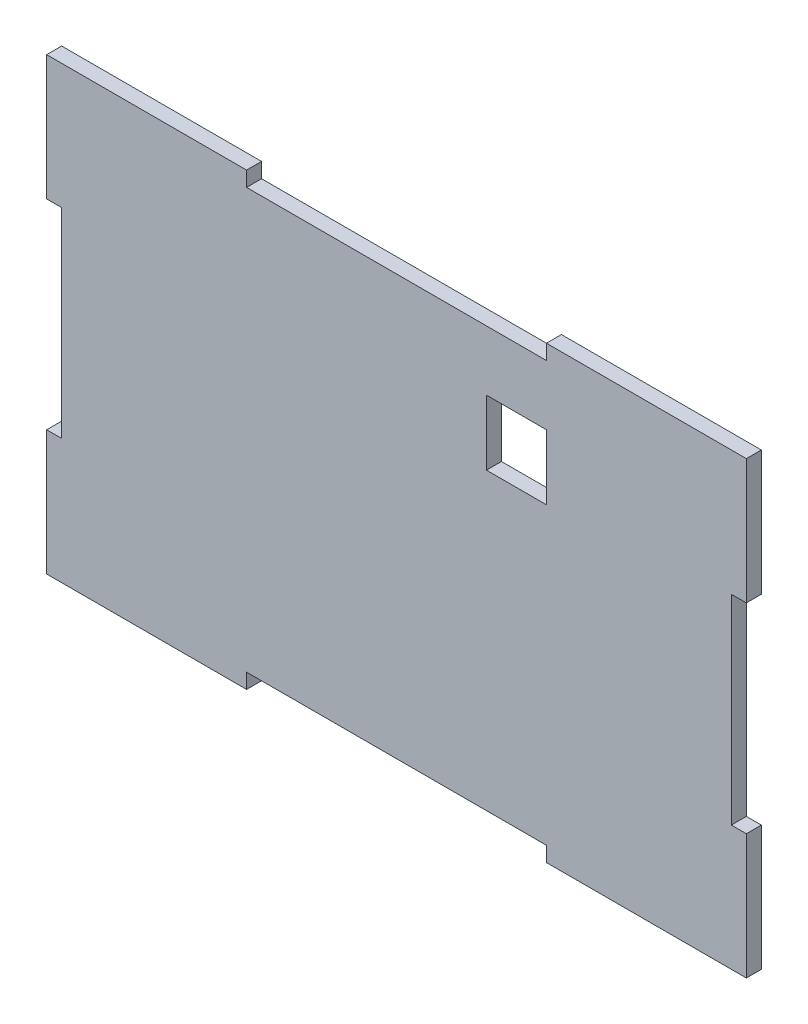
ISO-10303-21;
HEADER;
FILE_DESCRIPTION(('STEP AP214'),'2;1');
FILE_NAME('part.step','',(''),(''),'','','');
FILE_SCHEMA(('AUTOMOTIVE_DESIGN { 1 0 10303 214 1 1 1 1 }'));
ENDSEC;
DATA;
#1=APPLICATION_CONTEXT('core data for automotive mechanical design processes');
#2=APPLICATION_PROTOCOL_DEFINITION('international standard','automotive_design',2000,#1);
#3=PRODUCT_CONTEXT('',#1,'mechanical');
#4=PRODUCT('Part','Part','',(#3));
#5=PRODUCT_RELATED_PRODUCT_CATEGORY('part','',(#4));
#6=PRODUCT_DEFINITION_FORMATION('','',#4);
#7=PRODUCT_DEFINITION_CONTEXT('part definition',#1,'design');
#8=PRODUCT_DEFINITION('design','',#6,#7);
#9=PRODUCT_DEFINITION_SHAPE('','',#8);
#10=(LENGTH_UNIT() NAMED_UNIT(*) SI_UNIT(.MILLI.,.METRE.));
#11=(NAMED_UNIT(*) PLANE_ANGLE_UNIT() SI_UNIT($,.RADIAN.));
#12=(NAMED_UNIT(*) SI_UNIT($,.STERADIAN.) SOLID_ANGLE_UNIT());
#13=UNCERTAINTY_MEASURE_WITH_UNIT(LENGTH_MEASURE(1.E-05),#10,'distance_accuracy_value','');
#14=(GEOMETRIC_REPRESENTATION_CONTEXT(3) GLOBAL_UNCERTAINTY_ASSIGNED_CONTEXT((#13)) GLOBAL_UNIT_ASSIGNED_CONTEXT((#10,
#11,#12)) REPRESENTATION_CONTEXT('',''));
#15=CARTESIAN_POINT('',(0.,0.,0.));
#16=DIRECTION('',(0.,0.,1.));
#17=DIRECTION('',(1.,0.,0.));
#18=AXIS2_PLACEMENT_3D('',#15,#16,#17);
#19=CARTESIAN_POINT('',(0.,0.,3.));
#20=DIRECTION('',(1.,0.,0.));
#21=DIRECTION('',(0.,0.,-1.));
#22=AXIS2_PLACEMENT_3D('',#19,#20,#21);
#23=PLANE('',#22);
#24=DIRECTION('',(0.,-1.,0.));
#25=VECTOR('',#24,1.);
#26=CARTESIAN_POINT('',(0.,0.,0.));
#27=LINE('',#26,#25);
#28=CARTESIAN_POINT('',(0.,25.,0.));
#29=VERTEX_POINT('',#28);
#30=CARTESIAN_POINT('',(0.,0.,0.));
#31=VERTEX_POINT('',#30);
#32=EDGE_CURVE('E228',#29,#31,#27,.T.);
#33=ORIENTED_EDGE('',*,*,#32,.T.);
#34=DIRECTION('',(0.,0.,-1.));
#35=VECTOR('',#34,1.);
#36=CARTESIAN_POINT('',(0.,0.,3.));
#37=LINE('',#36,#35);
#38=CARTESIAN_POINT('',(0.,0.,3.));
#39=VERTEX_POINT('',#38);
#40=EDGE_CURVE('E11',#39,#31,#37,.T.);
#41=ORIENTED_EDGE('',*,*,#40,.F.);
#42=DIRECTION('',(0.,-1.,0.));
#43=VECTOR('',#42,1.);
#44=CARTESIAN_POINT('',(0.,0.,3.));
#45=LINE('',#44,#43);
#46=CARTESIAN_POINT('',(0.,25.,3.));
#47=VERTEX_POINT('',#46);
#48=EDGE_CURVE('E232',#47,#39,#45,.T.);
#49=ORIENTED_EDGE('',*,*,#48,.F.);
#50=DIRECTION('',(0.,0.,-1.));
#51=VECTOR('',#50,1.);
#52=CARTESIAN_POINT('',(0.,25.,3.));
#53=LINE('',#52,#51);
#54=EDGE_CURVE('E274',#47,#29,#53,.T.);
#55=ORIENTED_EDGE('',*,*,#54,.T.);
#56=EDGE_LOOP('',(#33,#41,#49,#55));
#57=FACE_BOUND('',#56,.T.);
#58=ADVANCED_FACE('F35',(#57),#23,.F.);
#59=CARTESIAN_POINT('',(0.,0.,3.));
#60=DIRECTION('',(0.,1.,0.));
#61=DIRECTION('',(0.,0.,1.));
#62=AXIS2_PLACEMENT_3D('',#59,#60,#61);
#63=PLANE('',#62);
#64=DIRECTION('',(1.,0.,0.));
#65=VECTOR('',#64,1.);
#66=CARTESIAN_POINT('',(0.,0.,0.));
#67=LINE('',#66,#65);
#68=CARTESIAN_POINT('',(40.,0.,0.));
#69=VERTEX_POINT('',#68);
#70=EDGE_CURVE('E277',#31,#69,#67,.T.);
#71=ORIENTED_EDGE('',*,*,#70,.T.);
#72=DIRECTION('',(0.,0.,-1.));
#73=VECTOR('',#72,1.);
#74=CARTESIAN_POINT('',(40.,0.,3.));
#75=LINE('',#74,#73);
#76=CARTESIAN_POINT('',(40.,0.,3.));
#77=VERTEX_POINT('',#76);
#78=EDGE_CURVE('E42',#77,#69,#75,.T.);
#79=ORIENTED_EDGE('',*,*,#78,.F.);
#80=DIRECTION('',(1.,0.,0.));
#81=VECTOR('',#80,1.);
#82=CARTESIAN_POINT('',(0.,0.,3.));
#83=LINE('',#82,#81);
#84=EDGE_CURVE('E235',#39,#77,#83,.T.);
#85=ORIENTED_EDGE('',*,*,#84,.F.);
#86=ORIENTED_EDGE('',*,*,#40,.T.);
#87=EDGE_LOOP('',(#71,#79,#85,#86));
#88=FACE_BOUND('',#87,.T.);
#89=ADVANCED_FACE('F392',(#88),#63,.F.);
#90=CARTESIAN_POINT('',(40.,0.,3.));
#91=DIRECTION('',(-1.,0.,0.));
#92=DIRECTION('',(0.,0.,1.));
#93=AXIS2_PLACEMENT_3D('',#90,#91,#92);
#94=PLANE('',#93);
#95=DIRECTION('',(0.,1.,0.));
#96=VECTOR('',#95,1.);
#97=CARTESIAN_POINT('',(40.,0.,0.));
#98=LINE('',#97,#96);
#99=CARTESIAN_POINT('',(40.,3.,0.));
#100=VERTEX_POINT('',#99);
#101=EDGE_CURVE('E279',#69,#100,#98,.T.);
#102=ORIENTED_EDGE('',*,*,#101,.T.);
#103=DIRECTION('',(0.,0.,-1.));
#104=VECTOR('',#103,1.);
#105=CARTESIAN_POINT('',(40.,3.,3.));
#106=LINE('',#105,#104);
#107=CARTESIAN_POINT('',(40.,3.,3.));
#108=VERTEX_POINT('',#107);
#109=EDGE_CURVE('E364',#108,#100,#106,.T.);
#110=ORIENTED_EDGE('',*,*,#109,.F.);
#111=DIRECTION('',(0.,1.,0.));
#112=VECTOR('',#111,1.);
#113=CARTESIAN_POINT('',(40.,0.,3.));
#114=LINE('',#113,#112);
#115=EDGE_CURVE('E238',#77,#108,#114,.T.);
#116=ORIENTED_EDGE('',*,*,#115,.F.);
#117=ORIENTED_EDGE('',*,*,#78,.T.);
#118=EDGE_LOOP('',(#102,#110,#116,#117));
#119=FACE_BOUND('',#118,.T.);
#120=ADVANCED_FACE('F371',(#119),#94,.F.);
#121=CARTESIAN_POINT('',(40.,3.,3.));
#122=DIRECTION('',(0.,1.,0.));
#123=DIRECTION('',(-1.,0.,0.));
#124=AXIS2_PLACEMENT_3D('',#121,#122,#123);
#125=PLANE('',#124);
#126=DIRECTION('',(1.,0.,0.));
#127=VECTOR('',#126,1.);
#128=CARTESIAN_POINT('',(40.,3.,0.));
#129=LINE('',#128,#127);
#130=CARTESIAN_POINT('',(100.,3.,0.));
#131=VERTEX_POINT('',#130);
#132=EDGE_CURVE('E281',#100,#131,#129,.T.);
#133=ORIENTED_EDGE('',*,*,#132,.T.);
#134=DIRECTION('',(0.,0.,-1.));
#135=VECTOR('',#134,1.);
#136=CARTESIAN_POINT('',(100.,3.,3.));
#137=LINE('',#136,#135);
#138=CARTESIAN_POINT('',(100.,3.,3.));
#139=VERTEX_POINT('',#138);
#140=EDGE_CURVE('E361',#139,#131,#137,.T.);
#141=ORIENTED_EDGE('',*,*,#140,.F.);
#142=DIRECTION('',(1.,0.,0.));
#143=VECTOR('',#142,1.);
#144=CARTESIAN_POINT('',(40.,3.,3.));
#145=LINE('',#144,#143);
#146=EDGE_CURVE('E240',#108,#139,#145,.T.);
#147=ORIENTED_EDGE('',*,*,#146,.F.);
#148=ORIENTED_EDGE('',*,*,#109,.T.);
#149=EDGE_LOOP('',(#133,#141,#147,#148));
#150=FACE_BOUND('',#149,.T.);
#151=ADVANCED_FACE('F380',(#150),#125,.F.);
#152=CARTESIAN_POINT('',(100.,0.,3.));
#153=DIRECTION('',(1.,0.,0.));
#154=DIRECTION('',(0.,0.,-1.));
#155=AXIS2_PLACEMENT_3D('',#152,#153,#154);
#156=PLANE('',#155);
#157=DIRECTION('',(0.,-1.,0.));
#158=VECTOR('',#157,1.);
#159=CARTESIAN_POINT('',(100.,0.,0.));
#160=LINE('',#159,#158);
#161=CARTESIAN_POINT('',(100.,0.,0.));
#162=VERTEX_POINT('',#161);
#163=EDGE_CURVE('E283',#131,#162,#160,.T.);
#164=ORIENTED_EDGE('',*,*,#163,.T.);
#165=DIRECTION('',(0.,0.,-1.));
#166=VECTOR('',#165,1.);
#167=CARTESIAN_POINT('',(100.,0.,3.));
#168=LINE('',#167,#166);
#169=CARTESIAN_POINT('',(100.,0.,3.));
#170=VERTEX_POINT('',#169);
#171=EDGE_CURVE('E358',#170,#162,#168,.T.);
#172=ORIENTED_EDGE('',*,*,#171,.F.);
#173=DIRECTION('',(0.,-1.,0.));
#174=VECTOR('',#173,1.);
#175=CARTESIAN_POINT('',(100.,0.,3.));
#176=LINE('',#175,#174);
#177=EDGE_CURVE('E242',#139,#170,#176,.T.);
#178=ORIENTED_EDGE('',*,*,#177,.F.);
#179=ORIENTED_EDGE('',*,*,#140,.T.);
#180=EDGE_LOOP('',(#164,#172,#178,#179));
#181=FACE_BOUND('',#180,.T.);
#182=ADVANCED_FACE('F384',(#181),#156,.F.);
#183=CARTESIAN_POINT('',(140.,0.,3.));
#184=DIRECTION('',(0.,1.,0.));
#185=DIRECTION('',(0.,0.,1.));
#186=AXIS2_PLACEMENT_3D('',#183,#184,#185);
#187=PLANE('',#186);
#188=DIRECTION('',(1.,0.,0.));
#189=VECTOR('',#188,1.);
#190=CARTESIAN_POINT('',(140.,0.,0.));
#191=LINE('',#190,#189);
#192=CARTESIAN_POINT('',(140.,0.,0.));
#193=VERTEX_POINT('',#192);
#194=EDGE_CURVE('E285',#162,#193,#191,.T.);
#195=ORIENTED_EDGE('',*,*,#194,.T.);
#196=DIRECTION('',(0.,0.,-1.));
#197=VECTOR('',#196,1.);
#198=CARTESIAN_POINT('',(140.,0.,3.));
#199=LINE('',#198,#197);
#200=CARTESIAN_POINT('',(140.,0.,3.));
#201=VERTEX_POINT('',#200);
#202=EDGE_CURVE('E355',#201,#193,#199,.T.);
#203=ORIENTED_EDGE('',*,*,#202,.F.);
#204=DIRECTION('',(1.,0.,0.));
#205=VECTOR('',#204,1.);
#206=CARTESIAN_POINT('',(140.,0.,3.));
#207=LINE('',#206,#205);
#208=EDGE_CURVE('E244',#170,#201,#207,.T.);
#209=ORIENTED_EDGE('',*,*,#208,.F.);
#210=ORIENTED_EDGE('',*,*,#171,.T.);
#211=EDGE_LOOP('',(#195,#203,#209,#210));
#212=FACE_BOUND('',#211,.T.);
#213=ADVANCED_FACE('F465',(#212),#187,.F.);
#214=CARTESIAN_POINT('',(140.,0.,3.));
#215=DIRECTION('',(-1.,0.,0.));
#216=DIRECTION('',(0.,0.,1.));
#217=AXIS2_PLACEMENT_3D('',#214,#215,#216);
#218=PLANE('',#217);
#219=DIRECTION('',(0.,1.,0.));
#220=VECTOR('',#219,1.);
#221=CARTESIAN_POINT('',(140.,0.,0.));
#222=LINE('',#221,#220);
#223=CARTESIAN_POINT('',(140.,25.,0.));
#224=VERTEX_POINT('',#223);
#225=EDGE_CURVE('E287',#193,#224,#222,.T.);
#226=ORIENTED_EDGE('',*,*,#225,.T.);
#227=DIRECTION('',(0.,0.,-1.));
#228=VECTOR('',#227,1.);
#229=CARTESIAN_POINT('',(140.,25.,3.));
#230=LINE('',#229,#228);
#231=CARTESIAN_POINT('',(140.,25.,3.));
#232=VERTEX_POINT('',#231);
#233=EDGE_CURVE('E352',#232,#224,#230,.T.);
#234=ORIENTED_EDGE('',*,*,#233,.F.);
#235=DIRECTION('',(0.,1.,0.));
#236=VECTOR('',#235,1.);
#237=CARTESIAN_POINT('',(140.,0.,3.));
#238=LINE('',#237,#236);
#239=EDGE_CURVE('E246',#201,#232,#238,.T.);
#240=ORIENTED_EDGE('',*,*,#239,.F.);
#241=ORIENTED_EDGE('',*,*,#202,.T.);
#242=EDGE_LOOP('',(#226,#234,#240,#241));
#243=FACE_BOUND('',#242,.T.);
#244=ADVANCED_FACE('F463',(#243),#218,.F.);
#245=CARTESIAN_POINT('',(140.,25.,3.));
#246=DIRECTION('',(0.,-1.,0.));
#247=DIRECTION('',(0.,0.,-1.));
#248=AXIS2_PLACEMENT_3D('',#245,#246,#247);
#249=PLANE('',#248);
#250=DIRECTION('',(-1.,0.,0.));
#251=VECTOR('',#250,1.);
#252=CARTESIAN_POINT('',(140.,25.,0.));
#253=LINE('',#252,#251);
#254=CARTESIAN_POINT('',(137.,25.,0.));
#255=VERTEX_POINT('',#254);
#256=EDGE_CURVE('E289',#224,#255,#253,.T.);
#257=ORIENTED_EDGE('',*,*,#256,.T.);
#258=DIRECTION('',(0.,0.,-1.));
#259=VECTOR('',#258,1.);
#260=CARTESIAN_POINT('',(137.,25.,3.));
#261=LINE('',#260,#259);
#262=CARTESIAN_POINT('',(137.,25.,3.));
#263=VERTEX_POINT('',#262);
#264=EDGE_CURVE('E349',#263,#255,#261,.T.);
#265=ORIENTED_EDGE('',*,*,#264,.F.);
#266=DIRECTION('',(-1.,0.,0.));
#267=VECTOR('',#266,1.);
#268=CARTESIAN_POINT('',(140.,25.,3.));
#269=LINE('',#268,#267);
#270=EDGE_CURVE('E248',#232,#263,#269,.T.);
#271=ORIENTED_EDGE('',*,*,#270,.F.);
#272=ORIENTED_EDGE('',*,*,#233,.T.);
#273=EDGE_LOOP('',(#257,#265,#271,#272));
#274=FACE_BOUND('',#273,.T.);
#275=ADVANCED_FACE('F458',(#274),#249,.F.);
#276=CARTESIAN_POINT('',(137.,25.,3.));
#277=DIRECTION('',(-1.,0.,0.));
#278=DIRECTION('',(0.,0.,1.));
#279=AXIS2_PLACEMENT_3D('',#276,#277,#278);
#280=PLANE('',#279);
#281=DIRECTION('',(0.,1.,0.));
#282=VECTOR('',#281,1.);
#283=CARTESIAN_POINT('',(137.,25.,0.));
#284=LINE('',#283,#282);
#285=CARTESIAN_POINT('',(137.,65.,0.));
#286=VERTEX_POINT('',#285);
#287=EDGE_CURVE('E291',#255,#286,#284,.T.);
#288=ORIENTED_EDGE('',*,*,#287,.T.);
#289=DIRECTION('',(0.,0.,-1.));
#290=VECTOR('',#289,1.);
#291=CARTESIAN_POINT('',(137.,65.,3.));
#292=LINE('',#291,#290);
#293=CARTESIAN_POINT('',(137.,65.,3.));
#294=VERTEX_POINT('',#293);
#295=EDGE_CURVE('E346',#294,#286,#292,.T.);
#296=ORIENTED_EDGE('',*,*,#295,.F.);
#297=DIRECTION('',(0.,1.,0.));
#298=VECTOR('',#297,1.);
#299=CARTESIAN_POINT('',(137.,25.,3.));
#300=LINE('',#299,#298);
#301=EDGE_CURVE('E250',#263,#294,#300,.T.);
#302=ORIENTED_EDGE('',*,*,#301,.F.);
#303=ORIENTED_EDGE('',*,*,#264,.T.);
#304=EDGE_LOOP('',(#288,#296,#302,#303));
#305=FACE_BOUND('',#304,.T.);
#306=ADVANCED_FACE('F453',(#305),#280,.F.);
#307=CARTESIAN_POINT('',(140.,65.,3.));
#308=DIRECTION('',(0.,1.,0.));
#309=DIRECTION('',(0.,0.,1.));
#310=AXIS2_PLACEMENT_3D('',#307,#308,#309);
#311=PLANE('',#310);
#312=DIRECTION('',(1.,0.,0.));
#313=VECTOR('',#312,1.);
#314=CARTESIAN_POINT('',(140.,65.,0.));
#315=LINE('',#314,#313);
#316=CARTESIAN_POINT('',(140.,65.,0.));
#317=VERTEX_POINT('',#316);
#318=EDGE_CURVE('E293',#286,#317,#315,.T.);
#319=ORIENTED_EDGE('',*,*,#318,.T.);
#320=DIRECTION('',(0.,0.,-1.));
#321=VECTOR('',#320,1.);
#322=CARTESIAN_POINT('',(140.,65.,3.));
#323=LINE('',#322,#321);
#324=CARTESIAN_POINT('',(140.,65.,3.));
#325=VERTEX_POINT('',#324);
#326=EDGE_CURVE('E343',#325,#317,#323,.T.);
#327=ORIENTED_EDGE('',*,*,#326,.F.);
#328=DIRECTION('',(1.,0.,0.));
#329=VECTOR('',#328,1.);
#330=CARTESIAN_POINT('',(140.,65.,3.));
#331=LINE('',#330,#329);
#332=EDGE_CURVE('E252',#294,#325,#331,.T.);
#333=ORIENTED_EDGE('',*,*,#332,.F.);
#334=ORIENTED_EDGE('',*,*,#295,.T.);
#335=EDGE_LOOP('',(#319,#327,#333,#334));
#336=FACE_BOUND('',#335,.T.);
#337=ADVANCED_FACE('F449',(#336),#311,.F.);
#338=CARTESIAN_POINT('',(140.,90.,3.));
#339=DIRECTION('',(-1.,0.,0.));
#340=DIRECTION('',(0.,0.,1.));
#341=AXIS2_PLACEMENT_3D('',#338,#339,#340);
#342=PLANE('',#341);
#343=DIRECTION('',(0.,1.,0.));
#344=VECTOR('',#343,1.);
#345=CARTESIAN_POINT('',(140.,90.,0.));
#346=LINE('',#345,#344);
#347=CARTESIAN_POINT('',(140.,90.,0.));
#348=VERTEX_POINT('',#347);
#349=EDGE_CURVE('E295',#317,#348,#346,.T.);
#350=ORIENTED_EDGE('',*,*,#349,.T.);
#351=DIRECTION('',(0.,0.,-1.));
#352=VECTOR('',#351,1.);
#353=CARTESIAN_POINT('',(140.,90.,3.));
#354=LINE('',#353,#352);
#355=CARTESIAN_POINT('',(140.,90.,3.));
#356=VERTEX_POINT('',#355);
#357=EDGE_CURVE('E340',#356,#348,#354,.T.);
#358=ORIENTED_EDGE('',*,*,#357,.F.);
#359=DIRECTION('',(0.,1.,0.));
#360=VECTOR('',#359,1.);
#361=CARTESIAN_POINT('',(140.,90.,3.));
#362=LINE('',#361,#360);
#363=EDGE_CURVE('E254',#325,#356,#362,.T.);
#364=ORIENTED_EDGE('',*,*,#363,.F.);
#365=ORIENTED_EDGE('',*,*,#326,.T.);
#366=EDGE_LOOP('',(#350,#358,#364,#365));
#367=FACE_BOUND('',#366,.T.);
#368=ADVANCED_FACE('F444',(#367),#342,.F.);
#369=CARTESIAN_POINT('',(140.,90.,3.));
#370=DIRECTION('',(0.,-1.,0.));
#371=DIRECTION('',(0.,0.,-1.));
#372=AXIS2_PLACEMENT_3D('',#369,#370,#371);
#373=PLANE('',#372);
#374=DIRECTION('',(-1.,0.,0.));
#375=VECTOR('',#374,1.);
#376=CARTESIAN_POINT('',(140.,90.,0.));
#377=LINE('',#376,#375);
#378=CARTESIAN_POINT('',(100.,90.,0.));
#379=VERTEX_POINT('',#378);
#380=EDGE_CURVE('E297',#348,#379,#377,.T.);
#381=ORIENTED_EDGE('',*,*,#380,.T.);
#382=DIRECTION('',(0.,0.,-1.));
#383=VECTOR('',#382,1.);
#384=CARTESIAN_POINT('',(100.,90.,3.));
#385=LINE('',#384,#383);
#386=CARTESIAN_POINT('',(100.,90.,3.));
#387=VERTEX_POINT('',#386);
#388=EDGE_CURVE('E337',#387,#379,#385,.T.);
#389=ORIENTED_EDGE('',*,*,#388,.F.);
#390=DIRECTION('',(-1.,0.,0.));
#391=VECTOR('',#390,1.);
#392=CARTESIAN_POINT('',(140.,90.,3.));
#393=LINE('',#392,#391);
#394=EDGE_CURVE('E256',#356,#387,#393,.T.);
#395=ORIENTED_EDGE('',*,*,#394,.F.);
#396=ORIENTED_EDGE('',*,*,#357,.T.);
#397=EDGE_LOOP('',(#381,#389,#395,#396));
#398=FACE_BOUND('',#397,.T.);
#399=ADVANCED_FACE('F438',(#398),#373,.F.);
#400=CARTESIAN_POINT('',(100.,90.,3.));
#401=DIRECTION('',(1.,0.,0.));
#402=DIRECTION('',(0.,0.,-1.));
#403=AXIS2_PLACEMENT_3D('',#400,#401,#402);
#404=PLANE('',#403);
#405=DIRECTION('',(0.,-1.,0.));
#406=VECTOR('',#405,1.);
#407=CARTESIAN_POINT('',(100.,90.,0.));
#408=LINE('',#407,#406);
#409=CARTESIAN_POINT('',(100.,87.,0.));
#410=VERTEX_POINT('',#409);
#411=EDGE_CURVE('E299',#379,#410,#408,.T.);
#412=ORIENTED_EDGE('',*,*,#411,.T.);
#413=DIRECTION('',(0.,0.,-1.));
#414=VECTOR('',#413,1.);
#415=CARTESIAN_POINT('',(100.,87.,3.));
#416=LINE('',#415,#414);
#417=CARTESIAN_POINT('',(100.,87.,3.));
#418=VERTEX_POINT('',#417);
#419=EDGE_CURVE('E334',#418,#410,#416,.T.);
#420=ORIENTED_EDGE('',*,*,#419,.F.);
#421=DIRECTION('',(0.,-1.,0.));
#422=VECTOR('',#421,1.);
#423=CARTESIAN_POINT('',(100.,90.,3.));
#424=LINE('',#423,#422);
#425=EDGE_CURVE('E258',#387,#418,#424,.T.);
#426=ORIENTED_EDGE('',*,*,#425,.F.);
#427=ORIENTED_EDGE('',*,*,#388,.T.);
#428=EDGE_LOOP('',(#412,#420,#426,#427));
#429=FACE_BOUND('',#428,.T.);
#430=ADVANCED_FACE('F434',(#429),#404,.F.);
#431=CARTESIAN_POINT('',(40.,87.,3.));
#432=DIRECTION('',(0.,-1.,0.));
#433=DIRECTION('',(0.,0.,-1.));
#434=AXIS2_PLACEMENT_3D('',#431,#432,#433);
#435=PLANE('',#434);
#436=DIRECTION('',(-1.,0.,0.));
#437=VECTOR('',#436,1.);
#438=CARTESIAN_POINT('',(40.,87.,0.));
#439=LINE('',#438,#437);
#440=CARTESIAN_POINT('',(40.,87.,0.));
#441=VERTEX_POINT('',#440);
#442=EDGE_CURVE('E301',#410,#441,#439,.T.);
#443=ORIENTED_EDGE('',*,*,#442,.T.);
#444=DIRECTION('',(0.,0.,-1.));
#445=VECTOR('',#444,1.);
#446=CARTESIAN_POINT('',(40.,87.,3.));
#447=LINE('',#446,#445);
#448=CARTESIAN_POINT('',(40.,87.,3.));
#449=VERTEX_POINT('',#448);
#450=EDGE_CURVE('E331',#449,#441,#447,.T.);
#451=ORIENTED_EDGE('',*,*,#450,.F.);
#452=DIRECTION('',(-1.,0.,0.));
#453=VECTOR('',#452,1.);
#454=CARTESIAN_POINT('',(40.,87.,3.));
#455=LINE('',#454,#453);
#456=EDGE_CURVE('E260',#418,#449,#455,.T.);
#457=ORIENTED_EDGE('',*,*,#456,.F.);
#458=ORIENTED_EDGE('',*,*,#419,.T.);
#459=EDGE_LOOP('',(#443,#451,#457,#458));
#460=FACE_BOUND('',#459,.T.);
#461=ADVANCED_FACE('F429',(#460),#435,.F.);
#462=CARTESIAN_POINT('',(40.,90.,3.));
#463=DIRECTION('',(-1.,0.,0.));
#464=DIRECTION('',(0.,0.,1.));
#465=AXIS2_PLACEMENT_3D('',#462,#463,#464);
#466=PLANE('',#465);
#467=DIRECTION('',(0.,1.,0.));
#468=VECTOR('',#467,1.);
#469=CARTESIAN_POINT('',(40.,90.,0.));
#470=LINE('',#469,#468);
#471=CARTESIAN_POINT('',(40.,90.,0.));
#472=VERTEX_POINT('',#471);
#473=EDGE_CURVE('E303',#441,#472,#470,.T.);
#474=ORIENTED_EDGE('',*,*,#473,.T.);
#475=DIRECTION('',(0.,0.,-1.));
#476=VECTOR('',#475,1.);
#477=CARTESIAN_POINT('',(40.,90.,3.));
#478=LINE('',#477,#476);
#479=CARTESIAN_POINT('',(40.,90.,3.));
#480=VERTEX_POINT('',#479);
#481=EDGE_CURVE('E328',#480,#472,#478,.T.);
#482=ORIENTED_EDGE('',*,*,#481,.F.);
#483=DIRECTION('',(0.,1.,0.));
#484=VECTOR('',#483,1.);
#485=CARTESIAN_POINT('',(40.,90.,3.));
#486=LINE('',#485,#484);
#487=EDGE_CURVE('E262',#449,#480,#486,.T.);
#488=ORIENTED_EDGE('',*,*,#487,.F.);
#489=ORIENTED_EDGE('',*,*,#450,.T.);
#490=EDGE_LOOP('',(#474,#482,#488,#489));
#491=FACE_BOUND('',#490,.T.);
#492=ADVANCED_FACE('F423',(#491),#466,.F.);
#493=CARTESIAN_POINT('',(0.,90.,3.));
#494=DIRECTION('',(0.,-1.,0.));
#495=DIRECTION('',(0.,0.,-1.));
#496=AXIS2_PLACEMENT_3D('',#493,#494,#495);
#497=PLANE('',#496);
#498=DIRECTION('',(-1.,0.,0.));
#499=VECTOR('',#498,1.);
#500=CARTESIAN_POINT('',(0.,90.,0.));
#501=LINE('',#500,#499);
#502=CARTESIAN_POINT('',(0.,90.,0.));
#503=VERTEX_POINT('',#502);
#504=EDGE_CURVE('E305',#472,#503,#501,.T.);
#505=ORIENTED_EDGE('',*,*,#504,.T.);
#506=DIRECTION('',(0.,0.,-1.));
#507=VECTOR('',#506,1.);
#508=CARTESIAN_POINT('',(0.,90.,3.));
#509=LINE('',#508,#507);
#510=CARTESIAN_POINT('',(0.,90.,3.));
#511=VERTEX_POINT('',#510);
#512=EDGE_CURVE('E325',#511,#503,#509,.T.);
#513=ORIENTED_EDGE('',*,*,#512,.F.);
#514=DIRECTION('',(-1.,0.,0.));
#515=VECTOR('',#514,1.);
#516=CARTESIAN_POINT('',(0.,90.,3.));
#517=LINE('',#516,#515);
#518=EDGE_CURVE('E264',#480,#511,#517,.T.);
#519=ORIENTED_EDGE('',*,*,#518,.F.);
#520=ORIENTED_EDGE('',*,*,#481,.T.);
#521=EDGE_LOOP('',(#505,#513,#519,#520));
#522=FACE_BOUND('',#521,.T.);
#523=ADVANCED_FACE('F419',(#522),#497,.F.);
#524=CARTESIAN_POINT('',(0.,90.,3.));
#525=DIRECTION('',(1.,0.,0.));
#526=DIRECTION('',(0.,0.,-1.));
#527=AXIS2_PLACEMENT_3D('',#524,#525,#526);
#528=PLANE('',#527);
#529=DIRECTION('',(0.,-1.,0.));
#530=VECTOR('',#529,1.);
#531=CARTESIAN_POINT('',(0.,90.,0.));
#532=LINE('',#531,#530);
#533=CARTESIAN_POINT('',(0.,65.,0.));
#534=VERTEX_POINT('',#533);
#535=EDGE_CURVE('E307',#503,#534,#532,.T.);
#536=ORIENTED_EDGE('',*,*,#535,.T.);
#537=DIRECTION('',(0.,0.,-1.));
#538=VECTOR('',#537,1.);
#539=CARTESIAN_POINT('',(0.,65.,3.));
#540=LINE('',#539,#538);
#541=CARTESIAN_POINT('',(0.,65.,3.));
#542=VERTEX_POINT('',#541);
#543=EDGE_CURVE('E322',#542,#534,#540,.T.);
#544=ORIENTED_EDGE('',*,*,#543,.F.);
#545=DIRECTION('',(0.,-1.,0.));
#546=VECTOR('',#545,1.);
#547=CARTESIAN_POINT('',(0.,90.,3.));
#548=LINE('',#547,#546);
#549=EDGE_CURVE('E266',#511,#542,#548,.T.);
#550=ORIENTED_EDGE('',*,*,#549,.F.);
#551=ORIENTED_EDGE('',*,*,#512,.T.);
#552=EDGE_LOOP('',(#536,#544,#550,#551));
#553=FACE_BOUND('',#552,.T.);
#554=ADVANCED_FACE('F414',(#553),#528,.F.);
#555=CARTESIAN_POINT('',(0.,65.,3.));
#556=DIRECTION('',(0.,1.,0.));
#557=DIRECTION('',(0.,0.,1.));
#558=AXIS2_PLACEMENT_3D('',#555,#556,#557);
#559=PLANE('',#558);
#560=DIRECTION('',(1.,0.,0.));
#561=VECTOR('',#560,1.);
#562=CARTESIAN_POINT('',(0.,65.,0.));
#563=LINE('',#562,#561);
#564=CARTESIAN_POINT('',(3.,65.,0.));
#565=VERTEX_POINT('',#564);
#566=EDGE_CURVE('E309',#534,#565,#563,.T.);
#567=ORIENTED_EDGE('',*,*,#566,.T.);
#568=DIRECTION('',(0.,0.,-1.));
#569=VECTOR('',#568,1.);
#570=CARTESIAN_POINT('',(3.,65.,3.));
#571=LINE('',#570,#569);
#572=CARTESIAN_POINT('',(3.,65.,3.));
#573=VERTEX_POINT('',#572);
#574=EDGE_CURVE('E319',#573,#565,#571,.T.);
#575=ORIENTED_EDGE('',*,*,#574,.F.);
#576=DIRECTION('',(1.,0.,0.));
#577=VECTOR('',#576,1.);
#578=CARTESIAN_POINT('',(0.,65.,3.));
#579=LINE('',#578,#577);
#580=EDGE_CURVE('E268',#542,#573,#579,.T.);
#581=ORIENTED_EDGE('',*,*,#580,.F.);
#582=ORIENTED_EDGE('',*,*,#543,.T.);
#583=EDGE_LOOP('',(#567,#575,#581,#582));
#584=FACE_BOUND('',#583,.T.);
#585=ADVANCED_FACE('F408',(#584),#559,.F.);
#586=CARTESIAN_POINT('',(3.,25.,3.));
#587=DIRECTION('',(1.,0.,0.));
#588=DIRECTION('',(0.,0.,-1.));
#589=AXIS2_PLACEMENT_3D('',#586,#587,#588);
#590=PLANE('',#589);
#591=DIRECTION('',(0.,-1.,0.));
#592=VECTOR('',#591,1.);
#593=CARTESIAN_POINT('',(3.,25.,0.));
#594=LINE('',#593,#592);
#595=CARTESIAN_POINT('',(3.,25.,0.));
#596=VERTEX_POINT('',#595);
#597=EDGE_CURVE('E311',#565,#596,#594,.T.);
#598=ORIENTED_EDGE('',*,*,#597,.T.);
#599=DIRECTION('',(0.,0.,-1.));
#600=VECTOR('',#599,1.);
#601=CARTESIAN_POINT('',(3.,25.,3.));
#602=LINE('',#601,#600);
#603=CARTESIAN_POINT('',(3.,25.,3.));
#604=VERTEX_POINT('',#603);
#605=EDGE_CURVE('E316',#604,#596,#602,.T.);
#606=ORIENTED_EDGE('',*,*,#605,.F.);
#607=DIRECTION('',(0.,-1.,0.));
#608=VECTOR('',#607,1.);
#609=CARTESIAN_POINT('',(3.,25.,3.));
#610=LINE('',#609,#608);
#611=EDGE_CURVE('E270',#573,#604,#610,.T.);
#612=ORIENTED_EDGE('',*,*,#611,.F.);
#613=ORIENTED_EDGE('',*,*,#574,.T.);
#614=EDGE_LOOP('',(#598,#606,#612,#613));
#615=FACE_BOUND('',#614,.T.);
#616=ADVANCED_FACE('F404',(#615),#590,.F.);
#617=CARTESIAN_POINT('',(0.,25.,3.));
#618=DIRECTION('',(0.,-1.,0.));
#619=DIRECTION('',(0.,0.,-1.));
#620=AXIS2_PLACEMENT_3D('',#617,#618,#619);
#621=PLANE('',#620);
#622=DIRECTION('',(-1.,0.,0.));
#623=VECTOR('',#622,1.);
#624=CARTESIAN_POINT('',(0.,25.,0.));
#625=LINE('',#624,#623);
#626=EDGE_CURVE('E236',#596,#29,#625,.T.);
#627=ORIENTED_EDGE('',*,*,#626,.T.);
#628=ORIENTED_EDGE('',*,*,#54,.F.);
#629=DIRECTION('',(-1.,0.,0.));
#630=VECTOR('',#629,1.);
#631=CARTESIAN_POINT('',(0.,25.,3.));
#632=LINE('',#631,#630);
#633=EDGE_CURVE('E272',#604,#47,#632,.T.);
#634=ORIENTED_EDGE('',*,*,#633,.F.);
#635=ORIENTED_EDGE('',*,*,#605,.T.);
#636=EDGE_LOOP('',(#627,#628,#634,#635));
#637=FACE_BOUND('',#636,.T.);
#638=ADVANCED_FACE('F399',(#637),#621,.F.);
#639=CARTESIAN_POINT('',(0.,0.,3.));
#640=DIRECTION('',(0.,0.,-1.));
#641=DIRECTION('',(-1.,0.,0.));
#642=AXIS2_PLACEMENT_3D('',#639,#640,#641);
#643=PLANE('',#642);
#644=DIRECTION('',(1.,0.,0.));
#645=VECTOR('',#644,1.);
#646=CARTESIAN_POINT('',(88.,62.,3.));
#647=LINE('',#646,#645);
#648=CARTESIAN_POINT('',(88.,62.,3.));
#649=VERTEX_POINT('',#648);
#650=CARTESIAN_POINT('',(100.,62.,3.));
#651=VERTEX_POINT('',#650);
#652=EDGE_CURVE('E222',#649,#651,#647,.T.);
#653=ORIENTED_EDGE('',*,*,#652,.F.);
#654=DIRECTION('',(0.,-1.,0.));
#655=VECTOR('',#654,1.);
#656=CARTESIAN_POINT('',(88.,75.,3.));
#657=LINE('',#656,#655);
#658=CARTESIAN_POINT('',(88.,75.,3.));
#659=VERTEX_POINT('',#658);
#660=EDGE_CURVE('E49',#659,#649,#657,.T.);
#661=ORIENTED_EDGE('',*,*,#660,.F.);
#662=DIRECTION('',(-1.,0.,0.));
#663=VECTOR('',#662,1.);
#664=CARTESIAN_POINT('',(88.,75.,3.));
#665=LINE('',#664,#663);
#666=CARTESIAN_POINT('',(100.,75.,3.));
#667=VERTEX_POINT('',#666);
#668=EDGE_CURVE('E213',#667,#659,#665,.T.);
#669=ORIENTED_EDGE('',*,*,#668,.F.);
#670=DIRECTION('',(0.,1.,0.));
#671=VECTOR('',#670,1.);
#672=CARTESIAN_POINT('',(100.,75.,3.));
#673=LINE('',#672,#671);
#674=EDGE_CURVE('E216',#651,#667,#673,.T.);
#675=ORIENTED_EDGE('',*,*,#674,.F.);
#676=EDGE_LOOP('',(#653,#661,#669,#675));
#677=FACE_BOUND('',#676,.T.);
#678=ORIENTED_EDGE('',*,*,#48,.T.);
#679=ORIENTED_EDGE('',*,*,#84,.T.);
#680=ORIENTED_EDGE('',*,*,#115,.T.);
#681=ORIENTED_EDGE('',*,*,#146,.T.);
#682=ORIENTED_EDGE('',*,*,#177,.T.);
#683=ORIENTED_EDGE('',*,*,#208,.T.);
#684=ORIENTED_EDGE('',*,*,#239,.T.);
#685=ORIENTED_EDGE('',*,*,#270,.T.);
#686=ORIENTED_EDGE('',*,*,#301,.T.);
#687=ORIENTED_EDGE('',*,*,#332,.T.);
#688=ORIENTED_EDGE('',*,*,#363,.T.);
#689=ORIENTED_EDGE('',*,*,#394,.T.);
#690=ORIENTED_EDGE('',*,*,#425,.T.);
#691=ORIENTED_EDGE('',*,*,#456,.T.);
#692=ORIENTED_EDGE('',*,*,#487,.T.);
#693=ORIENTED_EDGE('',*,*,#518,.T.);
#694=ORIENTED_EDGE('',*,*,#549,.T.);
#695=ORIENTED_EDGE('',*,*,#580,.T.);
#696=ORIENTED_EDGE('',*,*,#611,.T.);
#697=ORIENTED_EDGE('',*,*,#633,.T.);
#698=EDGE_LOOP('',(#678,#679,#680,#681,#682,#683,#684,#685,#686,#687,#688,#689,#690,#691,#692,
#693,#694,#695,#696,#697));
#699=FACE_BOUND('',#698,.T.);
#700=ADVANCED_FACE('F388',(#677,#699),#643,.F.);
#701=CARTESIAN_POINT('',(0.,0.,0.));
#702=DIRECTION('',(0.,0.,-1.));
#703=DIRECTION('',(-1.,0.,0.));
#704=AXIS2_PLACEMENT_3D('',#701,#702,#703);
#705=PLANE('',#704);
#706=DIRECTION('',(0.,-1.,0.));
#707=VECTOR('',#706,1.);
#708=CARTESIAN_POINT('',(88.,75.,0.));
#709=LINE('',#708,#707);
#710=CARTESIAN_POINT('',(88.,75.,0.));
#711=VERTEX_POINT('',#710);
#712=CARTESIAN_POINT('',(88.,62.,0.));
#713=VERTEX_POINT('',#712);
#714=EDGE_CURVE('E197',#711,#713,#709,.T.);
#715=ORIENTED_EDGE('',*,*,#714,.T.);
#716=DIRECTION('',(1.,0.,0.));
#717=VECTOR('',#716,1.);
#718=CARTESIAN_POINT('',(88.,62.,0.));
#719=LINE('',#718,#717);
#720=CARTESIAN_POINT('',(100.,62.,0.));
#721=VERTEX_POINT('',#720);
#722=EDGE_CURVE('E206',#713,#721,#719,.T.);
#723=ORIENTED_EDGE('',*,*,#722,.T.);
#724=DIRECTION('',(0.,1.,0.));
#725=VECTOR('',#724,1.);
#726=CARTESIAN_POINT('',(100.,75.,0.));
#727=LINE('',#726,#725);
#728=CARTESIAN_POINT('',(100.,75.,0.));
#729=VERTEX_POINT('',#728);
#730=EDGE_CURVE('E57',#721,#729,#727,.T.);
#731=ORIENTED_EDGE('',*,*,#730,.T.);
#732=DIRECTION('',(-1.,0.,0.));
#733=VECTOR('',#732,1.);
#734=CARTESIAN_POINT('',(88.,75.,0.));
#735=LINE('',#734,#733);
#736=EDGE_CURVE('E203',#729,#711,#735,.T.);
#737=ORIENTED_EDGE('',*,*,#736,.T.);
#738=EDGE_LOOP('',(#715,#723,#731,#737));
#739=FACE_BOUND('',#738,.T.);
#740=ORIENTED_EDGE('',*,*,#32,.F.);
#741=ORIENTED_EDGE('',*,*,#626,.F.);
#742=ORIENTED_EDGE('',*,*,#597,.F.);
#743=ORIENTED_EDGE('',*,*,#566,.F.);
#744=ORIENTED_EDGE('',*,*,#535,.F.);
#745=ORIENTED_EDGE('',*,*,#504,.F.);
#746=ORIENTED_EDGE('',*,*,#473,.F.);
#747=ORIENTED_EDGE('',*,*,#442,.F.);
#748=ORIENTED_EDGE('',*,*,#411,.F.);
#749=ORIENTED_EDGE('',*,*,#380,.F.);
#750=ORIENTED_EDGE('',*,*,#349,.F.);
#751=ORIENTED_EDGE('',*,*,#318,.F.);
#752=ORIENTED_EDGE('',*,*,#287,.F.);
#753=ORIENTED_EDGE('',*,*,#256,.F.);
#754=ORIENTED_EDGE('',*,*,#225,.F.);
#755=ORIENTED_EDGE('',*,*,#194,.F.);
#756=ORIENTED_EDGE('',*,*,#163,.F.);
#757=ORIENTED_EDGE('',*,*,#132,.F.);
#758=ORIENTED_EDGE('',*,*,#101,.F.);
#759=ORIENTED_EDGE('',*,*,#70,.F.);
#760=EDGE_LOOP('',(#740,#741,#742,#743,#744,#745,#746,#747,#748,#749,#750,#751,#752,#753,#754,
#755,#756,#757,#758,#759));
#761=FACE_BOUND('',#760,.T.);
#762=ADVANCED_FACE('F210',(#739,#761),#705,.T.);
#763=CARTESIAN_POINT('',(88.,75.,0.));
#764=DIRECTION('',(-1.,0.,0.));
#765=DIRECTION('',(0.,-1.,0.));
#766=AXIS2_PLACEMENT_3D('',#763,#764,#765);
#767=PLANE('',#766);
#768=ORIENTED_EDGE('',*,*,#660,.T.);
#769=DIRECTION('',(0.,0.,1.));
#770=VECTOR('',#769,1.);
#771=CARTESIAN_POINT('',(88.,62.,0.));
#772=LINE('',#771,#770);
#773=EDGE_CURVE('E193',#713,#649,#772,.T.);
#774=ORIENTED_EDGE('',*,*,#773,.F.);
#775=ORIENTED_EDGE('',*,*,#714,.F.);
#776=DIRECTION('',(0.,0.,1.));
#777=VECTOR('',#776,1.);
#778=CARTESIAN_POINT('',(88.,75.,0.));
#779=LINE('',#778,#777);
#780=EDGE_CURVE('E226',#711,#659,#779,.T.);
#781=ORIENTED_EDGE('',*,*,#780,.T.);
#782=EDGE_LOOP('',(#768,#774,#775,#781));
#783=FACE_BOUND('',#782,.T.);
#784=ADVANCED_FACE('F195',(#783),#767,.F.);
#785=CARTESIAN_POINT('',(88.,75.,0.));
#786=DIRECTION('',(0.,1.,0.));
#787=DIRECTION('',(0.,0.,1.));
#788=AXIS2_PLACEMENT_3D('',#785,#786,#787);
#789=PLANE('',#788);
#790=ORIENTED_EDGE('',*,*,#668,.T.);
#791=ORIENTED_EDGE('',*,*,#780,.F.);
#792=ORIENTED_EDGE('',*,*,#736,.F.);
#793=DIRECTION('',(0.,0.,1.));
#794=VECTOR('',#793,1.);
#795=CARTESIAN_POINT('',(100.,75.,0.));
#796=LINE('',#795,#794);
#797=EDGE_CURVE('E229',#729,#667,#796,.T.);
#798=ORIENTED_EDGE('',*,*,#797,.T.);
#799=EDGE_LOOP('',(#790,#791,#792,#798));
#800=FACE_BOUND('',#799,.T.);
#801=ADVANCED_FACE('F628',(#800),#789,.F.);
#802=CARTESIAN_POINT('',(100.,75.,0.));
#803=DIRECTION('',(1.,0.,0.));
#804=DIRECTION('',(0.,0.,-1.));
#805=AXIS2_PLACEMENT_3D('',#802,#803,#804);
#806=PLANE('',#805);
#807=ORIENTED_EDGE('',*,*,#674,.T.);
#808=ORIENTED_EDGE('',*,*,#797,.F.);
#809=ORIENTED_EDGE('',*,*,#730,.F.);
#810=DIRECTION('',(0.,0.,1.));
#811=VECTOR('',#810,1.);
#812=CARTESIAN_POINT('',(100.,62.,0.));
#813=LINE('',#812,#811);
#814=EDGE_CURVE('E202',#721,#651,#813,.T.);
#815=ORIENTED_EDGE('',*,*,#814,.T.);
#816=EDGE_LOOP('',(#807,#808,#809,#815));
#817=FACE_BOUND('',#816,.T.);
#818=ADVANCED_FACE('F637',(#817),#806,.F.);
#819=CARTESIAN_POINT('',(88.,62.,0.));
#820=DIRECTION('',(0.,-1.,0.));
#821=DIRECTION('',(0.,0.,-1.));
#822=AXIS2_PLACEMENT_3D('',#819,#820,#821);
#823=PLANE('',#822);
#824=ORIENTED_EDGE('',*,*,#652,.T.);
#825=ORIENTED_EDGE('',*,*,#814,.F.);
#826=ORIENTED_EDGE('',*,*,#722,.F.);
#827=ORIENTED_EDGE('',*,*,#773,.T.);
#828=EDGE_LOOP('',(#824,#825,#826,#827));
#829=FACE_BOUND('',#828,.T.);
#830=ADVANCED_FACE('F207',(#829),#823,.F.);
#831=CLOSED_SHELL('',(#58,#89,#120,#151,#182,#213,#244,#275,#306,#337,#368,#399,#430,#461,#492,
#523,#554,#585,#616,#638,#700,#762,#784,#801,#818,#830));
#832=MANIFOLD_SOLID_BREP('B2',#831);
#833=ADVANCED_BREP_SHAPE_REPRESENTATION('',(#18,#832),#14);
#834=SHAPE_DEFINITION_REPRESENTATION(#9,#833);
ENDSEC;
END-ISO-10303-21;
